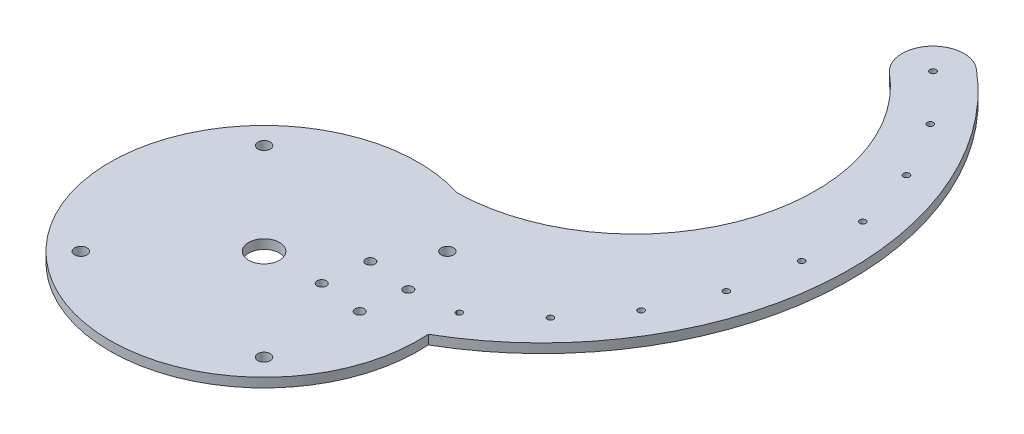
ISO-10303-21;
HEADER;
FILE_DESCRIPTION(('STEP AP214'),'2;1');
FILE_NAME('part.step','',(''),(''),'','','');
FILE_SCHEMA(('AUTOMOTIVE_DESIGN { 1 0 10303 214 1 1 1 1 }'));
ENDSEC;
DATA;
#1=APPLICATION_CONTEXT('core data for automotive mechanical design processes');
#2=APPLICATION_PROTOCOL_DEFINITION('international standard','automotive_design',2000,#1);
#3=PRODUCT_CONTEXT('',#1,'mechanical');
#4=PRODUCT('Part','Part','',(#3));
#5=PRODUCT_RELATED_PRODUCT_CATEGORY('part','',(#4));
#6=PRODUCT_DEFINITION_FORMATION('','',#4);
#7=PRODUCT_DEFINITION_CONTEXT('part definition',#1,'design');
#8=PRODUCT_DEFINITION('design','',#6,#7);
#9=PRODUCT_DEFINITION_SHAPE('','',#8);
#10=(LENGTH_UNIT() NAMED_UNIT(*) SI_UNIT(.MILLI.,.METRE.));
#11=(NAMED_UNIT(*) PLANE_ANGLE_UNIT() SI_UNIT($,.RADIAN.));
#12=(NAMED_UNIT(*) SI_UNIT($,.STERADIAN.) SOLID_ANGLE_UNIT());
#13=UNCERTAINTY_MEASURE_WITH_UNIT(LENGTH_MEASURE(1.E-05),#10,'distance_accuracy_value','');
#14=(GEOMETRIC_REPRESENTATION_CONTEXT(3) GLOBAL_UNCERTAINTY_ASSIGNED_CONTEXT((#13)) GLOBAL_UNIT_ASSIGNED_CONTEXT((#10,
#11,#12)) REPRESENTATION_CONTEXT('',''));
#15=CARTESIAN_POINT('',(0.,0.,0.));
#16=DIRECTION('',(0.,0.,1.));
#17=DIRECTION('',(1.,0.,0.));
#18=AXIS2_PLACEMENT_3D('',#15,#16,#17);
#19=CARTESIAN_POINT('',(0.,3.,0.));
#20=DIRECTION('',(0.,-1.,0.));
#21=DIRECTION('',(0.,0.,-1.));
#22=AXIS2_PLACEMENT_3D('',#19,#20,#21);
#23=CYLINDRICAL_SURFACE('',#22,50.);
#24=DIRECTION('',(0.,1.,0.));
#25=VECTOR('',#24,1.);
#26=CARTESIAN_POINT('',(48.068299249768,0.,-13.7636698316529));
#27=LINE('',#26,#25);
#28=CARTESIAN_POINT('',(48.068299249768,0.,-13.7636698316529));
#29=VERTEX_POINT('',#28);
#30=CARTESIAN_POINT('',(48.068299249768,3.,-13.7636698316529));
#31=VERTEX_POINT('',#30);
#32=EDGE_CURVE('E111',#29,#31,#27,.T.);
#33=ORIENTED_EDGE('',*,*,#32,.F.);
#34=CARTESIAN_POINT('',(0.,0.,0.));
#35=DIRECTION('',(0.,1.,0.));
#36=DIRECTION('',(0.,0.,1.));
#37=AXIS2_PLACEMENT_3D('',#34,#35,#36);
#38=CIRCLE('',#37,50.);
#39=CARTESIAN_POINT('',(47.8444829080086,0.,-14.5225843177197));
#40=VERTEX_POINT('',#39);
#41=EDGE_CURVE('E104',#29,#40,#38,.T.);
#42=ORIENTED_EDGE('',*,*,#41,.T.);
#43=DIRECTION('',(0.,1.,0.));
#44=VECTOR('',#43,1.);
#45=CARTESIAN_POINT('',(47.8444829080086,0.,-14.5225843177197));
#46=LINE('',#45,#44);
#47=CARTESIAN_POINT('',(47.8444829080086,3.,-14.5225843177197));
#48=VERTEX_POINT('',#47);
#49=EDGE_CURVE('E75',#40,#48,#46,.T.);
#50=ORIENTED_EDGE('',*,*,#49,.T.);
#51=CARTESIAN_POINT('',(0.,3.,0.));
#52=DIRECTION('',(0.,1.,0.));
#53=DIRECTION('',(0.,0.,1.));
#54=AXIS2_PLACEMENT_3D('',#51,#52,#53);
#55=CIRCLE('',#54,50.);
#56=EDGE_CURVE('E12',#31,#48,#55,.T.);
#57=ORIENTED_EDGE('',*,*,#56,.F.);
#58=EDGE_LOOP('',(#33,#42,#50,#57));
#59=FACE_BOUND('',#58,.T.);
#60=ADVANCED_FACE('F52',(#59),#23,.T.);
#61=CARTESIAN_POINT('',(15.,3.,-47.6969600708473));
#62=VERTEX_POINT('',#61);
#63=CARTESIAN_POINT('',(49.8887651569859,3.,-3.33333333333338));
#64=VERTEX_POINT('',#63);
#65=EDGE_CURVE('E61',#62,#64,#55,.T.);
#66=ORIENTED_EDGE('',*,*,#65,.F.);
#67=DIRECTION('',(0.,1.,0.));
#68=VECTOR('',#67,1.);
#69=CARTESIAN_POINT('',(15.,0.,-47.6969600708473));
#70=LINE('',#69,#68);
#71=CARTESIAN_POINT('',(15.,0.,-47.6969600708473));
#72=VERTEX_POINT('',#71);
#73=EDGE_CURVE('E170',#72,#62,#70,.T.);
#74=ORIENTED_EDGE('',*,*,#73,.F.);
#75=CARTESIAN_POINT('',(49.8887651569859,0.,-3.33333333333338));
#76=VERTEX_POINT('',#75);
#77=EDGE_CURVE('E56',#72,#76,#38,.T.);
#78=ORIENTED_EDGE('',*,*,#77,.T.);
#79=DIRECTION('',(0.,1.,0.));
#80=VECTOR('',#79,1.);
#81=CARTESIAN_POINT('',(49.8887651569859,0.,-3.33333333333338));
#82=LINE('',#81,#80);
#83=EDGE_CURVE('E115',#76,#64,#82,.T.);
#84=ORIENTED_EDGE('',*,*,#83,.T.);
#85=EDGE_LOOP('',(#66,#74,#78,#84));
#86=FACE_BOUND('',#85,.T.);
#87=ADVANCED_FACE('F54',(#86),#23,.T.);
#88=CARTESIAN_POINT('',(0.,3.,0.));
#89=DIRECTION('',(0.,1.,0.));
#90=DIRECTION('',(0.,0.,1.));
#91=AXIS2_PLACEMENT_3D('',#88,#89,#90);
#92=PLANE('',#91);
#93=CARTESIAN_POINT('',(13.7154518851808,3.,-106.345439058217));
#94=DIRECTION('',(0.,1.,0.));
#95=DIRECTION('',(0.,0.,1.));
#96=AXIS2_PLACEMENT_3D('',#93,#94,#95);
#97=CIRCLE('',#96,58.6625447060666);
#98=CARTESIAN_POINT('',(51.4230087749232,3.,-151.283555449518));
#99=VERTEX_POINT('',#98);
#100=EDGE_CURVE('E164',#99,#62,#97,.F.);
#101=ORIENTED_EDGE('',*,*,#100,.T.);
#102=ORIENTED_EDGE('',*,*,#65,.T.);
#103=CARTESIAN_POINT('',(0.,3.,-90.));
#104=DIRECTION('',(0.,1.,0.));
#105=DIRECTION('',(0.,0.,1.));
#106=AXIS2_PLACEMENT_3D('',#103,#104,#105);
#107=CIRCLE('',#106,100.);
#108=CARTESIAN_POINT('',(64.278760968654,3.,-166.604444311898));
#109=VERTEX_POINT('',#108);
#110=EDGE_CURVE('E159',#109,#64,#107,.F.);
#111=ORIENTED_EDGE('',*,*,#110,.F.);
#112=CARTESIAN_POINT('',(57.8508848717886,3.,-158.943999880708));
#113=DIRECTION('',(0.,1.,0.));
#114=DIRECTION('',(0.,0.,1.));
#115=AXIS2_PLACEMENT_3D('',#112,#113,#114);
#116=CIRCLE('',#115,10.);
#117=EDGE_CURVE('E162',#99,#109,#116,.F.);
#118=ORIENTED_EDGE('',*,*,#117,.F.);
#119=EDGE_LOOP('',(#101,#102,#111,#118));
#120=FACE_BOUND('',#119,.T.);
#121=CARTESIAN_POINT('',(34.0792678209601,3.,-12.6756804546839));
#122=DIRECTION('',(0.,1.,0.));
#123=DIRECTION('',(0.,0.,1.));
#124=AXIS2_PLACEMENT_3D('',#121,#122,#123);
#125=CIRCLE('',#124,1.5);
#126=CARTESIAN_POINT('',(34.0792678209601,3.,-11.1756804546838));
#127=VERTEX_POINT('',#126);
#128=EDGE_CURVE('E191',#127,#127,#125,.T.);
#129=ORIENTED_EDGE('',*,*,#128,.F.);
#130=EDGE_LOOP('',(#129));
#131=FACE_BOUND('',#130,.T.);
#132=CARTESIAN_POINT('',(32.3625238787934,3.,1.36186884129492));
#133=DIRECTION('',(0.,1.,0.));
#134=DIRECTION('',(0.,0.,1.));
#135=AXIS2_PLACEMENT_3D('',#132,#133,#134);
#136=CIRCLE('',#135,1.50000000000001);
#137=CARTESIAN_POINT('',(32.3625238787934,3.,2.86186884129493));
#138=VERTEX_POINT('',#137);
#139=EDGE_CURVE('E185',#138,#138,#136,.T.);
#140=ORIENTED_EDGE('',*,*,#139,.F.);
#141=EDGE_LOOP('',(#140));
#142=FACE_BOUND('',#141,.T.);
#143=CARTESIAN_POINT('',(18.3249745828146,3.,-0.354875100871746));
#144=DIRECTION('',(0.,1.,0.));
#145=DIRECTION('',(0.,0.,1.));
#146=AXIS2_PLACEMENT_3D('',#143,#144,#145);
#147=CIRCLE('',#146,1.49999999999999);
#148=CARTESIAN_POINT('',(18.3249745828146,3.,1.14512489912825));
#149=VERTEX_POINT('',#148);
#150=EDGE_CURVE('E178',#149,#149,#147,.T.);
#151=ORIENTED_EDGE('',*,*,#150,.F.);
#152=EDGE_LOOP('',(#151));
#153=FACE_BOUND('',#152,.T.);
#154=CARTESIAN_POINT('',(20.0417185249813,3.,-14.3924243968505));
#155=DIRECTION('',(0.,1.,0.));
#156=DIRECTION('',(0.,0.,1.));
#157=AXIS2_PLACEMENT_3D('',#154,#155,#156);
#158=CIRCLE('',#157,1.5);
#159=CARTESIAN_POINT('',(20.0417185249813,3.,-12.8924243968505));
#160=VERTEX_POINT('',#159);
#161=EDGE_CURVE('E181',#160,#160,#158,.T.);
#162=ORIENTED_EDGE('',*,*,#161,.F.);
#163=EDGE_LOOP('',(#162));
#164=FACE_BOUND('',#163,.T.);
#165=CARTESIAN_POINT('',(0.,3.,0.));
#166=DIRECTION('',(0.,1.,0.));
#167=DIRECTION('',(0.,0.,1.));
#168=AXIS2_PLACEMENT_3D('',#165,#166,#167);
#169=CIRCLE('',#168,5.);
#170=CARTESIAN_POINT('',(0.,3.,5.));
#171=VERTEX_POINT('',#170);
#172=EDGE_CURVE('E199',#171,#171,#169,.T.);
#173=ORIENTED_EDGE('',*,*,#172,.F.);
#174=EDGE_LOOP('',(#173));
#175=FACE_BOUND('',#174,.T.);
#176=CARTESIAN_POINT('',(-29.698484809835,3.,29.698484809835));
#177=DIRECTION('',(0.,1.,0.));
#178=DIRECTION('',(0.,0.,1.));
#179=AXIS2_PLACEMENT_3D('',#176,#177,#178);
#180=CIRCLE('',#179,2.);
#181=CARTESIAN_POINT('',(-29.698484809835,3.,31.698484809835));
#182=VERTEX_POINT('',#181);
#183=EDGE_CURVE('E221',#182,#182,#180,.T.);
#184=ORIENTED_EDGE('',*,*,#183,.F.);
#185=EDGE_LOOP('',(#184));
#186=FACE_BOUND('',#185,.T.);
#187=CARTESIAN_POINT('',(29.698484809835,3.,29.698484809835));
#188=DIRECTION('',(0.,1.,0.));
#189=DIRECTION('',(0.,0.,1.));
#190=AXIS2_PLACEMENT_3D('',#187,#188,#189);
#191=CIRCLE('',#190,2.);
#192=CARTESIAN_POINT('',(29.698484809835,3.,31.698484809835));
#193=VERTEX_POINT('',#192);
#194=EDGE_CURVE('E215',#193,#193,#191,.T.);
#195=ORIENTED_EDGE('',*,*,#194,.F.);
#196=EDGE_LOOP('',(#195));
#197=FACE_BOUND('',#196,.T.);
#198=CARTESIAN_POINT('',(29.698484809835,3.,-29.698484809835));
#199=DIRECTION('',(0.,1.,0.));
#200=DIRECTION('',(0.,0.,1.));
#201=AXIS2_PLACEMENT_3D('',#198,#199,#200);
#202=CIRCLE('',#201,2.);
#203=CARTESIAN_POINT('',(29.698484809835,3.,-27.698484809835));
#204=VERTEX_POINT('',#203);
#205=EDGE_CURVE('E208',#204,#204,#202,.T.);
#206=ORIENTED_EDGE('',*,*,#205,.F.);
#207=EDGE_LOOP('',(#206));
#208=FACE_BOUND('',#207,.T.);
#209=CARTESIAN_POINT('',(-29.698484809835,3.,-29.698484809835));
#210=DIRECTION('',(0.,1.,0.));
#211=DIRECTION('',(0.,0.,1.));
#212=AXIS2_PLACEMENT_3D('',#209,#210,#211);
#213=CIRCLE('',#212,2.);
#214=CARTESIAN_POINT('',(-29.698484809835,3.,-27.698484809835));
#215=VERTEX_POINT('',#214);
#216=EDGE_CURVE('E211',#215,#215,#213,.T.);
#217=ORIENTED_EDGE('',*,*,#216,.F.);
#218=EDGE_LOOP('',(#217));
#219=FACE_BOUND('',#218,.T.);
#220=ORIENTED_EDGE('',*,*,#56,.T.);
#221=CARTESIAN_POINT('',(48.8372974155406,3.,-14.4029208160393));
#222=DIRECTION('',(0.,1.,0.));
#223=DIRECTION('',(0.,0.,1.));
#224=AXIS2_PLACEMENT_3D('',#221,#222,#223);
#225=CIRCLE('',#224,0.999999999999998);
#226=EDGE_CURVE('E157',#31,#48,#225,.T.);
#227=ORIENTED_EDGE('',*,*,#226,.F.);
#228=EDGE_LOOP('',(#220,#227));
#229=FACE_BOUND('',#228,.T.);
#230=CARTESIAN_POINT('',(65.0186152131303,3.,-27.7699455587022));
#231=DIRECTION('',(0.,1.,0.));
#232=DIRECTION('',(0.,0.,1.));
#233=AXIS2_PLACEMENT_3D('',#230,#231,#232);
#234=CIRCLE('',#233,0.999999999999998);
#235=CARTESIAN_POINT('',(65.0186152131303,3.,-26.7699455587022));
#236=VERTEX_POINT('',#235);
#237=EDGE_CURVE('E133',#236,#236,#234,.T.);
#238=ORIENTED_EDGE('',*,*,#237,.F.);
#239=EDGE_LOOP('',(#238));
#240=FACE_BOUND('',#239,.T.);
#241=CARTESIAN_POINT('',(77.6639446179939,3.,-44.5213049178722));
#242=DIRECTION('',(0.,1.,0.));
#243=DIRECTION('',(0.,0.,1.));
#244=AXIS2_PLACEMENT_3D('',#241,#242,#243);
#245=CIRCLE('',#244,0.999999999999998);
#246=CARTESIAN_POINT('',(77.6639446179939,3.,-43.5213049178722));
#247=VERTEX_POINT('',#246);
#248=EDGE_CURVE('E136',#247,#247,#245,.T.);
#249=ORIENTED_EDGE('',*,*,#248,.F.);
#250=EDGE_LOOP('',(#249));
#251=FACE_BOUND('',#250,.T.);
#252=CARTESIAN_POINT('',(86.0855789195036,3.,-63.7459888380097));
#253=DIRECTION('',(0.,1.,0.));
#254=DIRECTION('',(0.,0.,1.));
#255=AXIS2_PLACEMENT_3D('',#252,#253,#254);
#256=CIRCLE('',#255,0.999999999999998);
#257=CARTESIAN_POINT('',(86.0855789195036,3.,-62.7459888380097));
#258=VERTEX_POINT('',#257);
#259=EDGE_CURVE('E139',#258,#258,#256,.T.);
#260=ORIENTED_EDGE('',*,*,#259,.F.);
#261=EDGE_LOOP('',(#260));
#262=FACE_BOUND('',#261,.T.);
#263=CARTESIAN_POINT('',(89.8255138824059,3.,-84.3984773711338));
#264=DIRECTION('',(0.,1.,0.));
#265=DIRECTION('',(0.,0.,1.));
#266=AXIS2_PLACEMENT_3D('',#263,#264,#265);
#267=CIRCLE('',#266,0.999999999999998);
#268=CARTESIAN_POINT('',(89.8255138824059,3.,-83.3984773711338));
#269=VERTEX_POINT('',#268);
#270=EDGE_CURVE('E142',#269,#269,#267,.T.);
#271=ORIENTED_EDGE('',*,*,#270,.F.);
#272=EDGE_LOOP('',(#271));
#273=FACE_BOUND('',#272,.T.);
#274=CARTESIAN_POINT('',(88.6803559620209,3.,-105.355600491327));
#275=DIRECTION('',(0.,1.,0.));
#276=DIRECTION('',(0.,0.,1.));
#277=AXIS2_PLACEMENT_3D('',#274,#275,#276);
#278=CIRCLE('',#277,0.999999999999998);
#279=CARTESIAN_POINT('',(88.6803559620209,3.,-104.355600491327));
#280=VERTEX_POINT('',#279);
#281=EDGE_CURVE('E145',#280,#280,#278,.T.);
#282=ORIENTED_EDGE('',*,*,#281,.F.);
#283=EDGE_LOOP('',(#282));
#284=FACE_BOUND('',#283,.T.);
#285=CARTESIAN_POINT('',(82.7123837089,3.,-125.477620850216));
#286=DIRECTION('',(0.,1.,0.));
#287=DIRECTION('',(0.,0.,1.));
#288=AXIS2_PLACEMENT_3D('',#285,#286,#287);
#289=CIRCLE('',#288,0.999999999999998);
#290=CARTESIAN_POINT('',(82.7123837089,3.,-124.477620850216));
#291=VERTEX_POINT('',#290);
#292=EDGE_CURVE('E148',#291,#291,#289,.T.);
#293=ORIENTED_EDGE('',*,*,#292,.F.);
#294=EDGE_LOOP('',(#293));
#295=FACE_BOUND('',#294,.T.);
#296=CARTESIAN_POINT('',(72.2461607967845,3.,-143.670217533798));
#297=DIRECTION('',(0.,1.,0.));
#298=DIRECTION('',(0.,0.,1.));
#299=AXIS2_PLACEMENT_3D('',#296,#297,#298);
#300=CIRCLE('',#299,0.999999999999998);
#301=CARTESIAN_POINT('',(72.2461607967845,3.,-142.670217533798));
#302=VERTEX_POINT('',#301);
#303=EDGE_CURVE('E151',#302,#302,#300,.T.);
#304=ORIENTED_EDGE('',*,*,#303,.F.);
#305=EDGE_LOOP('',(#304));
#306=FACE_BOUND('',#305,.T.);
#307=CARTESIAN_POINT('',(57.8508848717886,3.,-158.943999880708));
#308=DIRECTION('',(0.,1.,0.));
#309=DIRECTION('',(0.,0.,1.));
#310=AXIS2_PLACEMENT_3D('',#307,#308,#309);
#311=CIRCLE('',#310,0.999999999999998);
#312=CARTESIAN_POINT('',(57.8508848717886,3.,-157.943999880708));
#313=VERTEX_POINT('',#312);
#314=EDGE_CURVE('E154',#313,#313,#311,.T.);
#315=ORIENTED_EDGE('',*,*,#314,.F.);
#316=EDGE_LOOP('',(#315));
#317=FACE_BOUND('',#316,.T.);
#318=ADVANCED_FACE('F232',(#120,#131,#142,#153,#164,#175,#186,#197,#208,#219,#229,#240,#251,
#262,#273,#284,#295,#306,#317),#92,.T.);
#319=CARTESIAN_POINT('',(0.,0.,0.));
#320=DIRECTION('',(0.,1.,0.));
#321=DIRECTION('',(0.,0.,1.));
#322=AXIS2_PLACEMENT_3D('',#319,#320,#321);
#323=PLANE('',#322);
#324=ORIENTED_EDGE('',*,*,#77,.F.);
#325=CARTESIAN_POINT('',(13.7154518851808,0.,-106.345439058217));
#326=DIRECTION('',(0.,1.,0.));
#327=DIRECTION('',(0.,0.,1.));
#328=AXIS2_PLACEMENT_3D('',#325,#326,#327);
#329=CIRCLE('',#328,58.6625447060666);
#330=CARTESIAN_POINT('',(51.4230087749232,0.,-151.283555449518));
#331=VERTEX_POINT('',#330);
#332=EDGE_CURVE('E116',#331,#72,#329,.F.);
#333=ORIENTED_EDGE('',*,*,#332,.F.);
#334=CARTESIAN_POINT('',(57.8508848717886,0.,-158.943999880708));
#335=DIRECTION('',(0.,1.,0.));
#336=DIRECTION('',(0.,0.,1.));
#337=AXIS2_PLACEMENT_3D('',#334,#335,#336);
#338=CIRCLE('',#337,10.);
#339=CARTESIAN_POINT('',(64.278760968654,0.,-166.604444311898));
#340=VERTEX_POINT('',#339);
#341=EDGE_CURVE('E123',#331,#340,#338,.F.);
#342=ORIENTED_EDGE('',*,*,#341,.T.);
#343=CARTESIAN_POINT('',(0.,0.,-90.));
#344=DIRECTION('',(0.,1.,0.));
#345=DIRECTION('',(0.,0.,1.));
#346=AXIS2_PLACEMENT_3D('',#343,#344,#345);
#347=CIRCLE('',#346,100.);
#348=EDGE_CURVE('E119',#340,#76,#347,.F.);
#349=ORIENTED_EDGE('',*,*,#348,.T.);
#350=EDGE_LOOP('',(#324,#333,#342,#349));
#351=FACE_BOUND('',#350,.T.);
#352=CARTESIAN_POINT('',(34.0792678209601,0.,-12.6756804546839));
#353=DIRECTION('',(0.,1.,0.));
#354=DIRECTION('',(0.,0.,1.));
#355=AXIS2_PLACEMENT_3D('',#352,#353,#354);
#356=CIRCLE('',#355,1.5);
#357=CARTESIAN_POINT('',(34.0792678209601,0.,-11.1756804546838));
#358=VERTEX_POINT('',#357);
#359=EDGE_CURVE('E169',#358,#358,#356,.T.);
#360=ORIENTED_EDGE('',*,*,#359,.T.);
#361=EDGE_LOOP('',(#360));
#362=FACE_BOUND('',#361,.T.);
#363=CARTESIAN_POINT('',(32.3625238787934,0.,1.36186884129492));
#364=DIRECTION('',(0.,1.,0.));
#365=DIRECTION('',(0.,0.,1.));
#366=AXIS2_PLACEMENT_3D('',#363,#364,#365);
#367=CIRCLE('',#366,1.50000000000001);
#368=CARTESIAN_POINT('',(32.3625238787934,0.,2.86186884129493));
#369=VERTEX_POINT('',#368);
#370=EDGE_CURVE('E188',#369,#369,#367,.T.);
#371=ORIENTED_EDGE('',*,*,#370,.T.);
#372=EDGE_LOOP('',(#371));
#373=FACE_BOUND('',#372,.T.);
#374=CARTESIAN_POINT('',(18.3249745828146,0.,-0.354875100871746));
#375=DIRECTION('',(0.,1.,0.));
#376=DIRECTION('',(0.,0.,1.));
#377=AXIS2_PLACEMENT_3D('',#374,#375,#376);
#378=CIRCLE('',#377,1.49999999999999);
#379=CARTESIAN_POINT('',(18.3249745828146,0.,1.14512489912825));
#380=VERTEX_POINT('',#379);
#381=EDGE_CURVE('E182',#380,#380,#378,.T.);
#382=ORIENTED_EDGE('',*,*,#381,.T.);
#383=EDGE_LOOP('',(#382));
#384=FACE_BOUND('',#383,.T.);
#385=CARTESIAN_POINT('',(20.0417185249813,0.,-14.3924243968505));
#386=DIRECTION('',(0.,1.,0.));
#387=DIRECTION('',(0.,0.,1.));
#388=AXIS2_PLACEMENT_3D('',#385,#386,#387);
#389=CIRCLE('',#388,1.5);
#390=CARTESIAN_POINT('',(20.0417185249813,0.,-12.8924243968505));
#391=VERTEX_POINT('',#390);
#392=EDGE_CURVE('E196',#391,#391,#389,.T.);
#393=ORIENTED_EDGE('',*,*,#392,.T.);
#394=EDGE_LOOP('',(#393));
#395=FACE_BOUND('',#394,.T.);
#396=CARTESIAN_POINT('',(0.,0.,0.));
#397=DIRECTION('',(0.,1.,0.));
#398=DIRECTION('',(0.,0.,1.));
#399=AXIS2_PLACEMENT_3D('',#396,#397,#398);
#400=CIRCLE('',#399,5.);
#401=CARTESIAN_POINT('',(0.,0.,5.));
#402=VERTEX_POINT('',#401);
#403=EDGE_CURVE('E202',#402,#402,#400,.T.);
#404=ORIENTED_EDGE('',*,*,#403,.T.);
#405=EDGE_LOOP('',(#404));
#406=FACE_BOUND('',#405,.T.);
#407=CARTESIAN_POINT('',(-29.698484809835,0.,29.698484809835));
#408=DIRECTION('',(0.,1.,0.));
#409=DIRECTION('',(0.,0.,1.));
#410=AXIS2_PLACEMENT_3D('',#407,#408,#409);
#411=CIRCLE('',#410,2.);
#412=CARTESIAN_POINT('',(-29.698484809835,0.,31.698484809835));
#413=VERTEX_POINT('',#412);
#414=EDGE_CURVE('E205',#413,#413,#411,.T.);
#415=ORIENTED_EDGE('',*,*,#414,.T.);
#416=EDGE_LOOP('',(#415));
#417=FACE_BOUND('',#416,.T.);
#418=CARTESIAN_POINT('',(29.698484809835,0.,29.698484809835));
#419=DIRECTION('',(0.,1.,0.));
#420=DIRECTION('',(0.,0.,1.));
#421=AXIS2_PLACEMENT_3D('',#418,#419,#420);
#422=CIRCLE('',#421,2.);
#423=CARTESIAN_POINT('',(29.698484809835,0.,31.698484809835));
#424=VERTEX_POINT('',#423);
#425=EDGE_CURVE('E218',#424,#424,#422,.T.);
#426=ORIENTED_EDGE('',*,*,#425,.T.);
#427=EDGE_LOOP('',(#426));
#428=FACE_BOUND('',#427,.T.);
#429=CARTESIAN_POINT('',(29.698484809835,0.,-29.698484809835));
#430=DIRECTION('',(0.,1.,0.));
#431=DIRECTION('',(0.,0.,1.));
#432=AXIS2_PLACEMENT_3D('',#429,#430,#431);
#433=CIRCLE('',#432,2.);
#434=CARTESIAN_POINT('',(29.698484809835,0.,-27.698484809835));
#435=VERTEX_POINT('',#434);
#436=EDGE_CURVE('E212',#435,#435,#433,.T.);
#437=ORIENTED_EDGE('',*,*,#436,.T.);
#438=EDGE_LOOP('',(#437));
#439=FACE_BOUND('',#438,.T.);
#440=CARTESIAN_POINT('',(-29.698484809835,0.,-29.698484809835));
#441=DIRECTION('',(0.,1.,0.));
#442=DIRECTION('',(0.,0.,1.));
#443=AXIS2_PLACEMENT_3D('',#440,#441,#442);
#444=CIRCLE('',#443,2.);
#445=CARTESIAN_POINT('',(-29.698484809835,0.,-27.698484809835));
#446=VERTEX_POINT('',#445);
#447=EDGE_CURVE('E226',#446,#446,#444,.T.);
#448=ORIENTED_EDGE('',*,*,#447,.T.);
#449=EDGE_LOOP('',(#448));
#450=FACE_BOUND('',#449,.T.);
#451=ORIENTED_EDGE('',*,*,#41,.F.);
#452=CARTESIAN_POINT('',(48.8372974155406,0.,-14.4029208160393));
#453=DIRECTION('',(0.,1.,0.));
#454=DIRECTION('',(0.,0.,1.));
#455=AXIS2_PLACEMENT_3D('',#452,#453,#454);
#456=CIRCLE('',#455,0.999999999999998);
#457=EDGE_CURVE('E109',#29,#40,#456,.T.);
#458=ORIENTED_EDGE('',*,*,#457,.T.);
#459=EDGE_LOOP('',(#451,#458));
#460=FACE_BOUND('',#459,.T.);
#461=CARTESIAN_POINT('',(65.0186152131303,0.,-27.7699455587022));
#462=DIRECTION('',(0.,1.,0.));
#463=DIRECTION('',(0.,0.,1.));
#464=AXIS2_PLACEMENT_3D('',#461,#462,#463);
#465=CIRCLE('',#464,0.999999999999998);
#466=CARTESIAN_POINT('',(65.0186152131303,0.,-26.7699455587022));
#467=VERTEX_POINT('',#466);
#468=EDGE_CURVE('E167',#467,#467,#465,.T.);
#469=ORIENTED_EDGE('',*,*,#468,.T.);
#470=EDGE_LOOP('',(#469));
#471=FACE_BOUND('',#470,.T.);
#472=CARTESIAN_POINT('',(77.6639446179939,0.,-44.5213049178722));
#473=DIRECTION('',(0.,1.,0.));
#474=DIRECTION('',(0.,0.,1.));
#475=AXIS2_PLACEMENT_3D('',#472,#473,#474);
#476=CIRCLE('',#475,0.999999999999998);
#477=CARTESIAN_POINT('',(77.6639446179939,0.,-43.5213049178722));
#478=VERTEX_POINT('',#477);
#479=EDGE_CURVE('E581',#478,#478,#476,.T.);
#480=ORIENTED_EDGE('',*,*,#479,.T.);
#481=EDGE_LOOP('',(#480));
#482=FACE_BOUND('',#481,.T.);
#483=CARTESIAN_POINT('',(86.0855789195036,0.,-63.7459888380097));
#484=DIRECTION('',(0.,1.,0.));
#485=DIRECTION('',(0.,0.,1.));
#486=AXIS2_PLACEMENT_3D('',#483,#484,#485);
#487=CIRCLE('',#486,0.999999999999998);
#488=CARTESIAN_POINT('',(86.0855789195036,0.,-62.7459888380097));
#489=VERTEX_POINT('',#488);
#490=EDGE_CURVE('E584',#489,#489,#487,.T.);
#491=ORIENTED_EDGE('',*,*,#490,.T.);
#492=EDGE_LOOP('',(#491));
#493=FACE_BOUND('',#492,.T.);
#494=CARTESIAN_POINT('',(89.8255138824059,0.,-84.3984773711338));
#495=DIRECTION('',(0.,1.,0.));
#496=DIRECTION('',(0.,0.,1.));
#497=AXIS2_PLACEMENT_3D('',#494,#495,#496);
#498=CIRCLE('',#497,0.999999999999998);
#499=CARTESIAN_POINT('',(89.8255138824059,0.,-83.3984773711338));
#500=VERTEX_POINT('',#499);
#501=EDGE_CURVE('E589',#500,#500,#498,.T.);
#502=ORIENTED_EDGE('',*,*,#501,.T.);
#503=EDGE_LOOP('',(#502));
#504=FACE_BOUND('',#503,.T.);
#505=CARTESIAN_POINT('',(88.6803559620209,0.,-105.355600491327));
#506=DIRECTION('',(0.,1.,0.));
#507=DIRECTION('',(0.,0.,1.));
#508=AXIS2_PLACEMENT_3D('',#505,#506,#507);
#509=CIRCLE('',#508,0.999999999999998);
#510=CARTESIAN_POINT('',(88.6803559620209,0.,-104.355600491327));
#511=VERTEX_POINT('',#510);
#512=EDGE_CURVE('E592',#511,#511,#509,.T.);
#513=ORIENTED_EDGE('',*,*,#512,.T.);
#514=EDGE_LOOP('',(#513));
#515=FACE_BOUND('',#514,.T.);
#516=CARTESIAN_POINT('',(82.7123837089,0.,-125.477620850216));
#517=DIRECTION('',(0.,1.,0.));
#518=DIRECTION('',(0.,0.,1.));
#519=AXIS2_PLACEMENT_3D('',#516,#517,#518);
#520=CIRCLE('',#519,0.999999999999998);
#521=CARTESIAN_POINT('',(82.7123837089,0.,-124.477620850216));
#522=VERTEX_POINT('',#521);
#523=EDGE_CURVE('E595',#522,#522,#520,.T.);
#524=ORIENTED_EDGE('',*,*,#523,.T.);
#525=EDGE_LOOP('',(#524));
#526=FACE_BOUND('',#525,.T.);
#527=CARTESIAN_POINT('',(72.2461607967845,0.,-143.670217533798));
#528=DIRECTION('',(0.,1.,0.));
#529=DIRECTION('',(0.,0.,1.));
#530=AXIS2_PLACEMENT_3D('',#527,#528,#529);
#531=CIRCLE('',#530,0.999999999999998);
#532=CARTESIAN_POINT('',(72.2461607967845,0.,-142.670217533798));
#533=VERTEX_POINT('',#532);
#534=EDGE_CURVE('E126',#533,#533,#531,.T.);
#535=ORIENTED_EDGE('',*,*,#534,.T.);
#536=EDGE_LOOP('',(#535));
#537=FACE_BOUND('',#536,.T.);
#538=CARTESIAN_POINT('',(57.8508848717886,0.,-158.943999880708));
#539=DIRECTION('',(0.,1.,0.));
#540=DIRECTION('',(0.,0.,1.));
#541=AXIS2_PLACEMENT_3D('',#538,#539,#540);
#542=CIRCLE('',#541,0.999999999999998);
#543=CARTESIAN_POINT('',(57.8508848717886,0.,-157.943999880708));
#544=VERTEX_POINT('',#543);
#545=EDGE_CURVE('E120',#544,#544,#542,.T.);
#546=ORIENTED_EDGE('',*,*,#545,.T.);
#547=EDGE_LOOP('',(#546));
#548=FACE_BOUND('',#547,.T.);
#549=ADVANCED_FACE('F106',(#351,#362,#373,#384,#395,#406,#417,#428,#439,#450,#460,#471,#482,
#493,#504,#515,#526,#537,#548),#323,.F.);
#550=CARTESIAN_POINT('',(-29.698484809835,0.,-29.698484809835));
#551=DIRECTION('',(0.,1.,0.));
#552=DIRECTION('',(0.,0.,1.));
#553=AXIS2_PLACEMENT_3D('',#550,#551,#552);
#554=CYLINDRICAL_SURFACE('',#553,2.);
#555=ORIENTED_EDGE('',*,*,#447,.F.);
#556=EDGE_LOOP('',(#555));
#557=FACE_BOUND('',#556,.T.);
#558=ORIENTED_EDGE('',*,*,#216,.T.);
#559=EDGE_LOOP('',(#558));
#560=FACE_BOUND('',#559,.T.);
#561=ADVANCED_FACE('F250',(#557,#560),#554,.F.);
#562=CARTESIAN_POINT('',(29.698484809835,0.,-29.698484809835));
#563=DIRECTION('',(0.,1.,0.));
#564=DIRECTION('',(0.,0.,1.));
#565=AXIS2_PLACEMENT_3D('',#562,#563,#564);
#566=CYLINDRICAL_SURFACE('',#565,2.);
#567=ORIENTED_EDGE('',*,*,#436,.F.);
#568=EDGE_LOOP('',(#567));
#569=FACE_BOUND('',#568,.T.);
#570=ORIENTED_EDGE('',*,*,#205,.T.);
#571=EDGE_LOOP('',(#570));
#572=FACE_BOUND('',#571,.T.);
#573=ADVANCED_FACE('F271',(#569,#572),#566,.F.);
#574=CARTESIAN_POINT('',(29.698484809835,0.,29.698484809835));
#575=DIRECTION('',(0.,1.,0.));
#576=DIRECTION('',(0.,0.,1.));
#577=AXIS2_PLACEMENT_3D('',#574,#575,#576);
#578=CYLINDRICAL_SURFACE('',#577,2.);
#579=ORIENTED_EDGE('',*,*,#425,.F.);
#580=EDGE_LOOP('',(#579));
#581=FACE_BOUND('',#580,.T.);
#582=ORIENTED_EDGE('',*,*,#194,.T.);
#583=EDGE_LOOP('',(#582));
#584=FACE_BOUND('',#583,.T.);
#585=ADVANCED_FACE('F335',(#581,#584),#578,.F.);
#586=CARTESIAN_POINT('',(-29.698484809835,0.,29.698484809835));
#587=DIRECTION('',(0.,1.,0.));
#588=DIRECTION('',(0.,0.,1.));
#589=AXIS2_PLACEMENT_3D('',#586,#587,#588);
#590=CYLINDRICAL_SURFACE('',#589,2.);
#591=ORIENTED_EDGE('',*,*,#414,.F.);
#592=EDGE_LOOP('',(#591));
#593=FACE_BOUND('',#592,.T.);
#594=ORIENTED_EDGE('',*,*,#183,.T.);
#595=EDGE_LOOP('',(#594));
#596=FACE_BOUND('',#595,.T.);
#597=ADVANCED_FACE('F343',(#593,#596),#590,.F.);
#598=CARTESIAN_POINT('',(0.,0.,0.));
#599=DIRECTION('',(0.,1.,0.));
#600=DIRECTION('',(0.,0.,1.));
#601=AXIS2_PLACEMENT_3D('',#598,#599,#600);
#602=CYLINDRICAL_SURFACE('',#601,5.);
#603=ORIENTED_EDGE('',*,*,#403,.F.);
#604=EDGE_LOOP('',(#603));
#605=FACE_BOUND('',#604,.T.);
#606=ORIENTED_EDGE('',*,*,#172,.T.);
#607=EDGE_LOOP('',(#606));
#608=FACE_BOUND('',#607,.T.);
#609=ADVANCED_FACE('F351',(#605,#608),#602,.F.);
#610=CARTESIAN_POINT('',(20.0417185249813,0.,-14.3924243968505));
#611=DIRECTION('',(0.,1.,0.));
#612=DIRECTION('',(0.,0.,1.));
#613=AXIS2_PLACEMENT_3D('',#610,#611,#612);
#614=CYLINDRICAL_SURFACE('',#613,1.5);
#615=ORIENTED_EDGE('',*,*,#392,.F.);
#616=EDGE_LOOP('',(#615));
#617=FACE_BOUND('',#616,.T.);
#618=ORIENTED_EDGE('',*,*,#161,.T.);
#619=EDGE_LOOP('',(#618));
#620=FACE_BOUND('',#619,.T.);
#621=ADVANCED_FACE('F359',(#617,#620),#614,.F.);
#622=CARTESIAN_POINT('',(18.3249745828146,0.,-0.354875100871746));
#623=DIRECTION('',(0.,1.,0.));
#624=DIRECTION('',(0.,0.,1.));
#625=AXIS2_PLACEMENT_3D('',#622,#623,#624);
#626=CYLINDRICAL_SURFACE('',#625,1.49999999999999);
#627=ORIENTED_EDGE('',*,*,#381,.F.);
#628=EDGE_LOOP('',(#627));
#629=FACE_BOUND('',#628,.T.);
#630=ORIENTED_EDGE('',*,*,#150,.T.);
#631=EDGE_LOOP('',(#630));
#632=FACE_BOUND('',#631,.T.);
#633=ADVANCED_FACE('F367',(#629,#632),#626,.F.);
#634=CARTESIAN_POINT('',(32.3625238787934,0.,1.36186884129492));
#635=DIRECTION('',(0.,1.,0.));
#636=DIRECTION('',(0.,0.,1.));
#637=AXIS2_PLACEMENT_3D('',#634,#635,#636);
#638=CYLINDRICAL_SURFACE('',#637,1.50000000000001);
#639=ORIENTED_EDGE('',*,*,#370,.F.);
#640=EDGE_LOOP('',(#639));
#641=FACE_BOUND('',#640,.T.);
#642=ORIENTED_EDGE('',*,*,#139,.T.);
#643=EDGE_LOOP('',(#642));
#644=FACE_BOUND('',#643,.T.);
#645=ADVANCED_FACE('F375',(#641,#644),#638,.F.);
#646=CARTESIAN_POINT('',(34.0792678209601,0.,-12.6756804546839));
#647=DIRECTION('',(0.,1.,0.));
#648=DIRECTION('',(0.,0.,1.));
#649=AXIS2_PLACEMENT_3D('',#646,#647,#648);
#650=CYLINDRICAL_SURFACE('',#649,1.5);
#651=ORIENTED_EDGE('',*,*,#359,.F.);
#652=EDGE_LOOP('',(#651));
#653=FACE_BOUND('',#652,.T.);
#654=ORIENTED_EDGE('',*,*,#128,.T.);
#655=EDGE_LOOP('',(#654));
#656=FACE_BOUND('',#655,.T.);
#657=ADVANCED_FACE('F383',(#653,#656),#650,.F.);
#658=CARTESIAN_POINT('',(48.8372974155406,0.,-14.4029208160393));
#659=DIRECTION('',(0.,1.,0.));
#660=DIRECTION('',(0.,0.,1.));
#661=AXIS2_PLACEMENT_3D('',#658,#659,#660);
#662=CYLINDRICAL_SURFACE('',#661,0.999999999999998);
#663=ORIENTED_EDGE('',*,*,#226,.T.);
#664=ORIENTED_EDGE('',*,*,#49,.F.);
#665=ORIENTED_EDGE('',*,*,#457,.F.);
#666=ORIENTED_EDGE('',*,*,#32,.T.);
#667=EDGE_LOOP('',(#663,#664,#665,#666));
#668=FACE_BOUND('',#667,.T.);
#669=ADVANCED_FACE('F118',(#668),#662,.F.);
#670=CARTESIAN_POINT('',(13.7154518851808,0.,-106.345439058217));
#671=DIRECTION('',(0.,1.,0.));
#672=DIRECTION('',(0.,0.,1.));
#673=AXIS2_PLACEMENT_3D('',#670,#671,#672);
#674=CYLINDRICAL_SURFACE('',#673,58.6625447060666);
#675=ORIENTED_EDGE('',*,*,#100,.F.);
#676=DIRECTION('',(0.,1.,0.));
#677=VECTOR('',#676,1.);
#678=CARTESIAN_POINT('',(51.4230087749232,0.,-151.283555449518));
#679=LINE('',#678,#677);
#680=EDGE_CURVE('E172',#331,#99,#679,.T.);
#681=ORIENTED_EDGE('',*,*,#680,.F.);
#682=ORIENTED_EDGE('',*,*,#332,.T.);
#683=ORIENTED_EDGE('',*,*,#73,.T.);
#684=EDGE_LOOP('',(#675,#681,#682,#683));
#685=FACE_BOUND('',#684,.T.);
#686=ADVANCED_FACE('F246',(#685),#674,.F.);
#687=CARTESIAN_POINT('',(57.8508848717886,0.,-158.943999880708));
#688=DIRECTION('',(0.,1.,0.));
#689=DIRECTION('',(0.,0.,1.));
#690=AXIS2_PLACEMENT_3D('',#687,#688,#689);
#691=CYLINDRICAL_SURFACE('',#690,10.);
#692=ORIENTED_EDGE('',*,*,#117,.T.);
#693=DIRECTION('',(0.,1.,0.));
#694=VECTOR('',#693,1.);
#695=CARTESIAN_POINT('',(64.278760968654,0.,-166.604444311898));
#696=LINE('',#695,#694);
#697=EDGE_CURVE('E174',#340,#109,#696,.T.);
#698=ORIENTED_EDGE('',*,*,#697,.F.);
#699=ORIENTED_EDGE('',*,*,#341,.F.);
#700=ORIENTED_EDGE('',*,*,#680,.T.);
#701=EDGE_LOOP('',(#692,#698,#699,#700));
#702=FACE_BOUND('',#701,.T.);
#703=ADVANCED_FACE('F243',(#702),#691,.T.);
#704=CARTESIAN_POINT('',(0.,0.,-90.));
#705=DIRECTION('',(0.,1.,0.));
#706=DIRECTION('',(0.,0.,1.));
#707=AXIS2_PLACEMENT_3D('',#704,#705,#706);
#708=CYLINDRICAL_SURFACE('',#707,100.);
#709=ORIENTED_EDGE('',*,*,#110,.T.);
#710=ORIENTED_EDGE('',*,*,#83,.F.);
#711=ORIENTED_EDGE('',*,*,#348,.F.);
#712=ORIENTED_EDGE('',*,*,#697,.T.);
#713=EDGE_LOOP('',(#709,#710,#711,#712));
#714=FACE_BOUND('',#713,.T.);
#715=ADVANCED_FACE('F238',(#714),#708,.T.);
#716=CARTESIAN_POINT('',(57.8508848717886,0.,-158.943999880708));
#717=DIRECTION('',(0.,1.,0.));
#718=DIRECTION('',(0.,0.,1.));
#719=AXIS2_PLACEMENT_3D('',#716,#717,#718);
#720=CYLINDRICAL_SURFACE('',#719,0.999999999999998);
#721=ORIENTED_EDGE('',*,*,#545,.F.);
#722=EDGE_LOOP('',(#721));
#723=FACE_BOUND('',#722,.T.);
#724=ORIENTED_EDGE('',*,*,#314,.T.);
#725=EDGE_LOOP('',(#724));
#726=FACE_BOUND('',#725,.T.);
#727=ADVANCED_FACE('F295',(#723,#726),#720,.F.);
#728=CARTESIAN_POINT('',(72.2461607967845,0.,-143.670217533798));
#729=DIRECTION('',(0.,1.,0.));
#730=DIRECTION('',(0.,0.,1.));
#731=AXIS2_PLACEMENT_3D('',#728,#729,#730);
#732=CYLINDRICAL_SURFACE('',#731,0.999999999999998);
#733=ORIENTED_EDGE('',*,*,#534,.F.);
#734=EDGE_LOOP('',(#733));
#735=FACE_BOUND('',#734,.T.);
#736=ORIENTED_EDGE('',*,*,#303,.T.);
#737=EDGE_LOOP('',(#736));
#738=FACE_BOUND('',#737,.T.);
#739=ADVANCED_FACE('F297',(#735,#738),#732,.F.);
#740=CARTESIAN_POINT('',(82.7123837089,0.,-125.477620850216));
#741=DIRECTION('',(0.,1.,0.));
#742=DIRECTION('',(0.,0.,1.));
#743=AXIS2_PLACEMENT_3D('',#740,#741,#742);
#744=CYLINDRICAL_SURFACE('',#743,0.999999999999998);
#745=ORIENTED_EDGE('',*,*,#523,.F.);
#746=EDGE_LOOP('',(#745));
#747=FACE_BOUND('',#746,.T.);
#748=ORIENTED_EDGE('',*,*,#292,.T.);
#749=EDGE_LOOP('',(#748));
#750=FACE_BOUND('',#749,.T.);
#751=ADVANCED_FACE('F304',(#747,#750),#744,.F.);
#752=CARTESIAN_POINT('',(88.6803559620209,0.,-105.355600491327));
#753=DIRECTION('',(0.,1.,0.));
#754=DIRECTION('',(0.,0.,1.));
#755=AXIS2_PLACEMENT_3D('',#752,#753,#754);
#756=CYLINDRICAL_SURFACE('',#755,0.999999999999998);
#757=ORIENTED_EDGE('',*,*,#512,.F.);
#758=EDGE_LOOP('',(#757));
#759=FACE_BOUND('',#758,.T.);
#760=ORIENTED_EDGE('',*,*,#281,.T.);
#761=EDGE_LOOP('',(#760));
#762=FACE_BOUND('',#761,.T.);
#763=ADVANCED_FACE('F434',(#759,#762),#756,.F.);
#764=CARTESIAN_POINT('',(89.8255138824059,0.,-84.3984773711338));
#765=DIRECTION('',(0.,1.,0.));
#766=DIRECTION('',(0.,0.,1.));
#767=AXIS2_PLACEMENT_3D('',#764,#765,#766);
#768=CYLINDRICAL_SURFACE('',#767,0.999999999999998);
#769=ORIENTED_EDGE('',*,*,#501,.F.);
#770=EDGE_LOOP('',(#769));
#771=FACE_BOUND('',#770,.T.);
#772=ORIENTED_EDGE('',*,*,#270,.T.);
#773=EDGE_LOOP('',(#772));
#774=FACE_BOUND('',#773,.T.);
#775=ADVANCED_FACE('F445',(#771,#774),#768,.F.);
#776=CARTESIAN_POINT('',(86.0855789195036,0.,-63.7459888380097));
#777=DIRECTION('',(0.,1.,0.));
#778=DIRECTION('',(0.,0.,1.));
#779=AXIS2_PLACEMENT_3D('',#776,#777,#778);
#780=CYLINDRICAL_SURFACE('',#779,0.999999999999998);
#781=ORIENTED_EDGE('',*,*,#490,.F.);
#782=EDGE_LOOP('',(#781));
#783=FACE_BOUND('',#782,.T.);
#784=ORIENTED_EDGE('',*,*,#259,.T.);
#785=EDGE_LOOP('',(#784));
#786=FACE_BOUND('',#785,.T.);
#787=ADVANCED_FACE('F456',(#783,#786),#780,.F.);
#788=CARTESIAN_POINT('',(77.6639446179939,0.,-44.5213049178722));
#789=DIRECTION('',(0.,1.,0.));
#790=DIRECTION('',(0.,0.,1.));
#791=AXIS2_PLACEMENT_3D('',#788,#789,#790);
#792=CYLINDRICAL_SURFACE('',#791,0.999999999999998);
#793=ORIENTED_EDGE('',*,*,#479,.F.);
#794=EDGE_LOOP('',(#793));
#795=FACE_BOUND('',#794,.T.);
#796=ORIENTED_EDGE('',*,*,#248,.T.);
#797=EDGE_LOOP('',(#796));
#798=FACE_BOUND('',#797,.T.);
#799=ADVANCED_FACE('F467',(#795,#798),#792,.F.);
#800=CARTESIAN_POINT('',(65.0186152131303,0.,-27.7699455587022));
#801=DIRECTION('',(0.,1.,0.));
#802=DIRECTION('',(0.,0.,1.));
#803=AXIS2_PLACEMENT_3D('',#800,#801,#802);
#804=CYLINDRICAL_SURFACE('',#803,0.999999999999998);
#805=ORIENTED_EDGE('',*,*,#468,.F.);
#806=EDGE_LOOP('',(#805));
#807=FACE_BOUND('',#806,.T.);
#808=ORIENTED_EDGE('',*,*,#237,.T.);
#809=EDGE_LOOP('',(#808));
#810=FACE_BOUND('',#809,.T.);
#811=ADVANCED_FACE('F478',(#807,#810),#804,.F.);
#812=CLOSED_SHELL('',(#60,#87,#318,#549,#561,#573,#585,#597,#609,#621,#633,#645,#657,#669,#686,
#703,#715,#727,#739,#751,#763,#775,#787,#799,#811));
#813=MANIFOLD_SOLID_BREP('B2',#812);
#814=ADVANCED_BREP_SHAPE_REPRESENTATION('',(#18,#813),#14);
#815=SHAPE_DEFINITION_REPRESENTATION(#9,#814);
ENDSEC;
END-ISO-10303-21;
